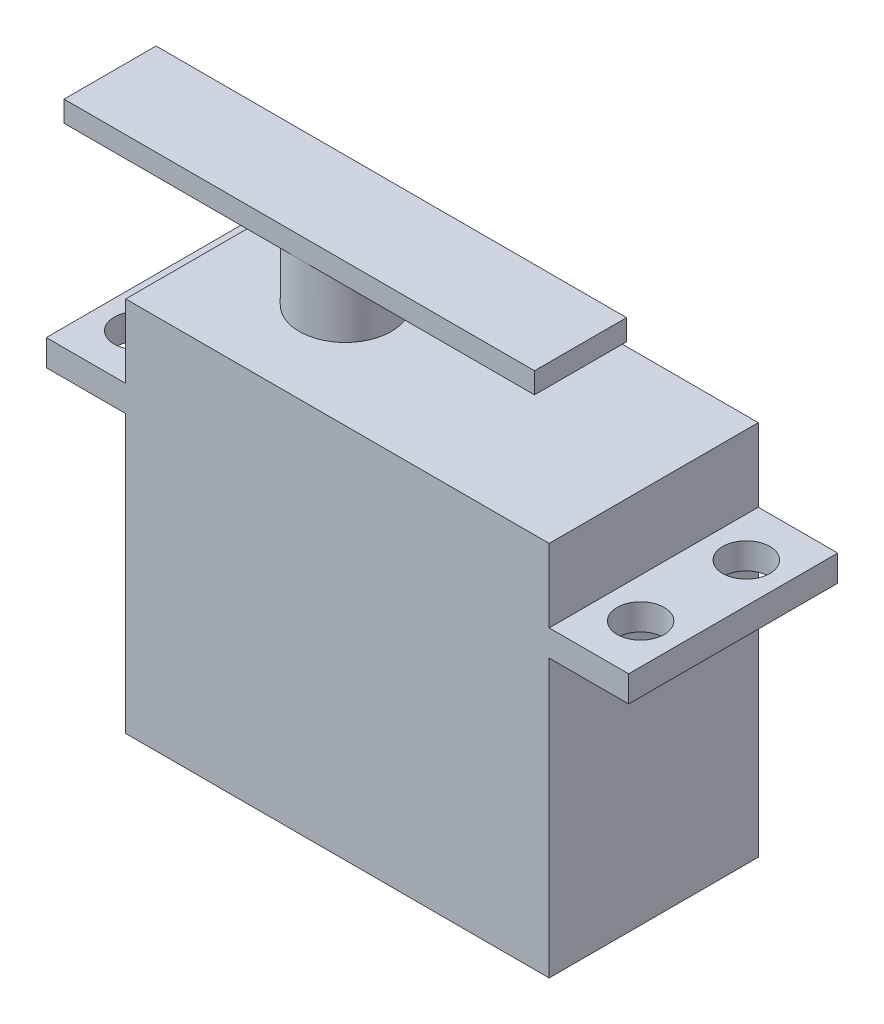
ISO-10303-21;
HEADER;
FILE_DESCRIPTION(('STEP AP214'),'2;1');
FILE_NAME('part.step','',(''),(''),'','','');
FILE_SCHEMA(('AUTOMOTIVE_DESIGN { 1 0 10303 214 1 1 1 1 }'));
ENDSEC;
DATA;
#1=APPLICATION_CONTEXT('core data for automotive mechanical design processes');
#2=APPLICATION_PROTOCOL_DEFINITION('international standard','automotive_design',2000,#1);
#3=PRODUCT_CONTEXT('',#1,'mechanical');
#4=PRODUCT('Part','Part','',(#3));
#5=PRODUCT_RELATED_PRODUCT_CATEGORY('part','',(#4));
#6=PRODUCT_DEFINITION_FORMATION('','',#4);
#7=PRODUCT_DEFINITION_CONTEXT('part definition',#1,'design');
#8=PRODUCT_DEFINITION('design','',#6,#7);
#9=PRODUCT_DEFINITION_SHAPE('','',#8);
#10=(LENGTH_UNIT() NAMED_UNIT(*) SI_UNIT(.MILLI.,.METRE.));
#11=(NAMED_UNIT(*) PLANE_ANGLE_UNIT() SI_UNIT($,.RADIAN.));
#12=(NAMED_UNIT(*) SI_UNIT($,.STERADIAN.) SOLID_ANGLE_UNIT());
#13=UNCERTAINTY_MEASURE_WITH_UNIT(LENGTH_MEASURE(1.E-05),#10,'distance_accuracy_value','');
#14=(GEOMETRIC_REPRESENTATION_CONTEXT(3) GLOBAL_UNCERTAINTY_ASSIGNED_CONTEXT((#13)) GLOBAL_UNIT_ASSIGNED_CONTEXT((#10,
#11,#12)) REPRESENTATION_CONTEXT('',''));
#15=CARTESIAN_POINT('',(0.,0.,0.));
#16=DIRECTION('',(0.,0.,1.));
#17=DIRECTION('',(1.,0.,0.));
#18=AXIS2_PLACEMENT_3D('',#15,#16,#17);
#19=CARTESIAN_POINT('',(-20.25,18.,10.));
#20=DIRECTION('',(0.,-1.,0.));
#21=DIRECTION('',(0.,0.,-1.));
#22=AXIS2_PLACEMENT_3D('',#19,#20,#21);
#23=PLANE('',#22);
#24=DIRECTION('',(-1.,0.,0.));
#25=VECTOR('',#24,1.);
#26=CARTESIAN_POINT('',(-20.25,18.,-10.));
#27=LINE('',#26,#25);
#28=CARTESIAN_POINT('',(20.25,18.,-10.));
#29=VERTEX_POINT('',#28);
#30=CARTESIAN_POINT('',(-20.25,18.,-10.));
#31=VERTEX_POINT('',#30);
#32=EDGE_CURVE('E261',#29,#31,#27,.T.);
#33=ORIENTED_EDGE('',*,*,#32,.T.);
#34=DIRECTION('',(0.,0.,-1.));
#35=VECTOR('',#34,1.);
#36=CARTESIAN_POINT('',(-20.25,18.,10.));
#37=LINE('',#36,#35);
#38=CARTESIAN_POINT('',(-20.25,18.,10.));
#39=VERTEX_POINT('',#38);
#40=EDGE_CURVE('E273',#39,#31,#37,.T.);
#41=ORIENTED_EDGE('',*,*,#40,.F.);
#42=DIRECTION('',(-1.,0.,0.));
#43=VECTOR('',#42,1.);
#44=CARTESIAN_POINT('',(-20.25,18.,10.));
#45=LINE('',#44,#43);
#46=CARTESIAN_POINT('',(20.25,18.,10.));
#47=VERTEX_POINT('',#46);
#48=EDGE_CURVE('E250',#47,#39,#45,.T.);
#49=ORIENTED_EDGE('',*,*,#48,.F.);
#50=DIRECTION('',(0.,0.,-1.));
#51=VECTOR('',#50,1.);
#52=CARTESIAN_POINT('',(20.25,18.,10.));
#53=LINE('',#52,#51);
#54=EDGE_CURVE('E276',#47,#29,#53,.T.);
#55=ORIENTED_EDGE('',*,*,#54,.T.);
#56=EDGE_LOOP('',(#33,#41,#49,#55));
#57=FACE_BOUND('',#56,.T.);
#58=CARTESIAN_POINT('',(-9.25000000000001,18.,0.));
#59=DIRECTION('',(0.,-1.,0.));
#60=DIRECTION('',(0.,0.,-1.));
#61=AXIS2_PLACEMENT_3D('',#58,#59,#60);
#62=CIRCLE('',#61,4.4);
#63=CARTESIAN_POINT('',(-9.25000000000001,18.,-4.4));
#64=VERTEX_POINT('',#63);
#65=EDGE_CURVE('E278',#64,#64,#62,.F.);
#66=ORIENTED_EDGE('',*,*,#65,.F.);
#67=EDGE_LOOP('',(#66));
#68=FACE_BOUND('',#67,.T.);
#69=ADVANCED_FACE('F35',(#57,#68),#23,.F.);
#70=CARTESIAN_POINT('',(20.25,18.,10.));
#71=DIRECTION('',(-1.,0.,0.));
#72=DIRECTION('',(0.,0.,1.));
#73=AXIS2_PLACEMENT_3D('',#70,#71,#72);
#74=PLANE('',#73);
#75=DIRECTION('',(0.,1.,0.));
#76=VECTOR('',#75,1.);
#77=CARTESIAN_POINT('',(20.25,18.,-10.));
#78=LINE('',#77,#76);
#79=CARTESIAN_POINT('',(20.25,-18.,-10.));
#80=VERTEX_POINT('',#79);
#81=CARTESIAN_POINT('',(20.25,8.5,-10.));
#82=VERTEX_POINT('',#81);
#83=EDGE_CURVE('E259',#80,#82,#78,.T.);
#84=ORIENTED_EDGE('',*,*,#83,.T.);
#85=DIRECTION('',(0.,0.,1.));
#86=VECTOR('',#85,1.);
#87=CARTESIAN_POINT('',(20.25,8.5,10.));
#88=LINE('',#87,#86);
#89=CARTESIAN_POINT('',(20.25,8.5,10.));
#90=VERTEX_POINT('',#89);
#91=EDGE_CURVE('E244',#82,#90,#88,.T.);
#92=ORIENTED_EDGE('',*,*,#91,.T.);
#93=DIRECTION('',(0.,1.,0.));
#94=VECTOR('',#93,1.);
#95=CARTESIAN_POINT('',(20.25,18.,10.));
#96=LINE('',#95,#94);
#97=CARTESIAN_POINT('',(20.25,-18.,10.));
#98=VERTEX_POINT('',#97);
#99=EDGE_CURVE('E247',#98,#90,#96,.T.);
#100=ORIENTED_EDGE('',*,*,#99,.F.);
#101=DIRECTION('',(0.,0.,-1.));
#102=VECTOR('',#101,1.);
#103=CARTESIAN_POINT('',(20.25,-18.,10.));
#104=LINE('',#103,#102);
#105=EDGE_CURVE('E258',#98,#80,#104,.T.);
#106=ORIENTED_EDGE('',*,*,#105,.T.);
#107=EDGE_LOOP('',(#84,#92,#100,#106));
#108=FACE_BOUND('',#107,.T.);
#109=ADVANCED_FACE('F310',(#108),#74,.F.);
#110=CARTESIAN_POINT('',(-20.25,18.,10.));
#111=DIRECTION('',(1.,0.,0.));
#112=DIRECTION('',(0.,1.,0.));
#113=AXIS2_PLACEMENT_3D('',#110,#111,#112);
#114=PLANE('',#113);
#115=DIRECTION('',(0.,-1.,0.));
#116=VECTOR('',#115,1.);
#117=CARTESIAN_POINT('',(-20.25,18.,10.));
#118=LINE('',#117,#116);
#119=CARTESIAN_POINT('',(-20.25,8.5,10.));
#120=VERTEX_POINT('',#119);
#121=CARTESIAN_POINT('',(-20.25,-18.,10.));
#122=VERTEX_POINT('',#121);
#123=EDGE_CURVE('E58',#120,#122,#118,.T.);
#124=ORIENTED_EDGE('',*,*,#123,.F.);
#125=DIRECTION('',(0.,0.,-1.));
#126=VECTOR('',#125,1.);
#127=CARTESIAN_POINT('',(-20.25,8.5,10.));
#128=LINE('',#127,#126);
#129=CARTESIAN_POINT('',(-20.25,8.5,-10.));
#130=VERTEX_POINT('',#129);
#131=EDGE_CURVE('E242',#120,#130,#128,.T.);
#132=ORIENTED_EDGE('',*,*,#131,.T.);
#133=DIRECTION('',(0.,-1.,0.));
#134=VECTOR('',#133,1.);
#135=CARTESIAN_POINT('',(-20.25,18.,-10.));
#136=LINE('',#135,#134);
#137=CARTESIAN_POINT('',(-20.25,-18.,-10.));
#138=VERTEX_POINT('',#137);
#139=EDGE_CURVE('E263',#130,#138,#136,.T.);
#140=ORIENTED_EDGE('',*,*,#139,.T.);
#141=DIRECTION('',(0.,0.,-1.));
#142=VECTOR('',#141,1.);
#143=CARTESIAN_POINT('',(-20.25,-18.,10.));
#144=LINE('',#143,#142);
#145=EDGE_CURVE('E270',#122,#138,#144,.T.);
#146=ORIENTED_EDGE('',*,*,#145,.F.);
#147=EDGE_LOOP('',(#124,#132,#140,#146));
#148=FACE_BOUND('',#147,.T.);
#149=ADVANCED_FACE('F315',(#148),#114,.F.);
#150=CARTESIAN_POINT('',(20.25,11.,10.));
#151=VERTEX_POINT('',#150);
#152=EDGE_CURVE('E251',#151,#47,#96,.T.);
#153=ORIENTED_EDGE('',*,*,#152,.F.);
#154=DIRECTION('',(0.,0.,-1.));
#155=VECTOR('',#154,1.);
#156=CARTESIAN_POINT('',(20.25,11.,10.));
#157=LINE('',#156,#155);
#158=CARTESIAN_POINT('',(20.25,11.,-10.));
#159=VERTEX_POINT('',#158);
#160=EDGE_CURVE('E239',#151,#159,#157,.T.);
#161=ORIENTED_EDGE('',*,*,#160,.T.);
#162=EDGE_CURVE('E246',#159,#29,#78,.T.);
#163=ORIENTED_EDGE('',*,*,#162,.T.);
#164=ORIENTED_EDGE('',*,*,#54,.F.);
#165=EDGE_LOOP('',(#153,#161,#163,#164));
#166=FACE_BOUND('',#165,.T.);
#167=ADVANCED_FACE('F37',(#166),#74,.F.);
#168=CARTESIAN_POINT('',(-20.25,11.,-10.));
#169=VERTEX_POINT('',#168);
#170=EDGE_CURVE('E264',#31,#169,#136,.T.);
#171=ORIENTED_EDGE('',*,*,#170,.T.);
#172=DIRECTION('',(0.,0.,1.));
#173=VECTOR('',#172,1.);
#174=CARTESIAN_POINT('',(-20.25,11.,10.));
#175=LINE('',#174,#173);
#176=CARTESIAN_POINT('',(-20.25,11.,10.));
#177=VERTEX_POINT('',#176);
#178=EDGE_CURVE('E237',#169,#177,#175,.T.);
#179=ORIENTED_EDGE('',*,*,#178,.T.);
#180=EDGE_CURVE('E253',#39,#177,#118,.T.);
#181=ORIENTED_EDGE('',*,*,#180,.F.);
#182=ORIENTED_EDGE('',*,*,#40,.T.);
#183=EDGE_LOOP('',(#171,#179,#181,#182));
#184=FACE_BOUND('',#183,.T.);
#185=ADVANCED_FACE('F319',(#184),#114,.F.);
#186=CARTESIAN_POINT('',(-20.25,-18.,10.));
#187=DIRECTION('',(0.,1.,0.));
#188=DIRECTION('',(0.,0.,1.));
#189=AXIS2_PLACEMENT_3D('',#186,#187,#188);
#190=PLANE('',#189);
#191=DIRECTION('',(1.,0.,0.));
#192=VECTOR('',#191,1.);
#193=CARTESIAN_POINT('',(-20.25,-18.,-10.));
#194=LINE('',#193,#192);
#195=EDGE_CURVE('E266',#138,#80,#194,.T.);
#196=ORIENTED_EDGE('',*,*,#195,.T.);
#197=ORIENTED_EDGE('',*,*,#105,.F.);
#198=DIRECTION('',(1.,0.,0.));
#199=VECTOR('',#198,1.);
#200=CARTESIAN_POINT('',(-20.25,-18.,10.));
#201=LINE('',#200,#199);
#202=EDGE_CURVE('E256',#122,#98,#201,.T.);
#203=ORIENTED_EDGE('',*,*,#202,.F.);
#204=ORIENTED_EDGE('',*,*,#145,.T.);
#205=EDGE_LOOP('',(#196,#197,#203,#204));
#206=FACE_BOUND('',#205,.T.);
#207=ADVANCED_FACE('F322',(#206),#190,.F.);
#208=CARTESIAN_POINT('',(0.,0.,10.));
#209=DIRECTION('',(0.,0.,1.));
#210=DIRECTION('',(1.,0.,0.));
#211=AXIS2_PLACEMENT_3D('',#208,#209,#210);
#212=PLANE('',#211);
#213=ORIENTED_EDGE('',*,*,#180,.T.);
#214=DIRECTION('',(-1.,0.,0.));
#215=VECTOR('',#214,1.);
#216=CARTESIAN_POINT('',(-27.85,11.,10.));
#217=LINE('',#216,#215);
#218=CARTESIAN_POINT('',(-27.85,11.,10.));
#219=VERTEX_POINT('',#218);
#220=EDGE_CURVE('E214',#177,#219,#217,.T.);
#221=ORIENTED_EDGE('',*,*,#220,.T.);
#222=DIRECTION('',(0.,-1.,0.));
#223=VECTOR('',#222,1.);
#224=CARTESIAN_POINT('',(-27.85,11.,10.));
#225=LINE('',#224,#223);
#226=CARTESIAN_POINT('',(-27.85,8.5,10.));
#227=VERTEX_POINT('',#226);
#228=EDGE_CURVE('E218',#219,#227,#225,.T.);
#229=ORIENTED_EDGE('',*,*,#228,.T.);
#230=DIRECTION('',(1.,0.,0.));
#231=VECTOR('',#230,1.);
#232=CARTESIAN_POINT('',(-27.85,8.5,10.));
#233=LINE('',#232,#231);
#234=EDGE_CURVE('E222',#227,#120,#233,.T.);
#235=ORIENTED_EDGE('',*,*,#234,.T.);
#236=ORIENTED_EDGE('',*,*,#123,.T.);
#237=ORIENTED_EDGE('',*,*,#202,.T.);
#238=ORIENTED_EDGE('',*,*,#99,.T.);
#239=CARTESIAN_POINT('',(27.85,8.5,10.));
#240=VERTEX_POINT('',#239);
#241=EDGE_CURVE('E221',#90,#240,#233,.T.);
#242=ORIENTED_EDGE('',*,*,#241,.T.);
#243=DIRECTION('',(0.,1.,0.));
#244=VECTOR('',#243,1.);
#245=CARTESIAN_POINT('',(27.85,11.,10.));
#246=LINE('',#245,#244);
#247=CARTESIAN_POINT('',(27.85,11.,10.));
#248=VERTEX_POINT('',#247);
#249=EDGE_CURVE('E197',#240,#248,#246,.T.);
#250=ORIENTED_EDGE('',*,*,#249,.T.);
#251=EDGE_CURVE('E215',#248,#151,#217,.T.);
#252=ORIENTED_EDGE('',*,*,#251,.T.);
#253=ORIENTED_EDGE('',*,*,#152,.T.);
#254=ORIENTED_EDGE('',*,*,#48,.T.);
#255=EDGE_LOOP('',(#213,#221,#229,#235,#236,#237,#238,#242,#250,#252,#253,#254));
#256=FACE_BOUND('',#255,.T.);
#257=ADVANCED_FACE('F326',(#256),#212,.T.);
#258=CARTESIAN_POINT('',(0.,0.,-10.));
#259=DIRECTION('',(0.,0.,1.));
#260=DIRECTION('',(1.,0.,0.));
#261=AXIS2_PLACEMENT_3D('',#258,#259,#260);
#262=PLANE('',#261);
#263=ORIENTED_EDGE('',*,*,#162,.F.);
#264=DIRECTION('',(1.,0.,0.));
#265=VECTOR('',#264,1.);
#266=CARTESIAN_POINT('',(-27.85,11.,-10.));
#267=LINE('',#266,#265);
#268=CARTESIAN_POINT('',(27.85,11.,-10.));
#269=VERTEX_POINT('',#268);
#270=EDGE_CURVE('E211',#159,#269,#267,.T.);
#271=ORIENTED_EDGE('',*,*,#270,.T.);
#272=DIRECTION('',(0.,-1.,0.));
#273=VECTOR('',#272,1.);
#274=CARTESIAN_POINT('',(27.85,11.,-10.));
#275=LINE('',#274,#273);
#276=CARTESIAN_POINT('',(27.85,8.5,-10.));
#277=VERTEX_POINT('',#276);
#278=EDGE_CURVE('E209',#269,#277,#275,.T.);
#279=ORIENTED_EDGE('',*,*,#278,.T.);
#280=DIRECTION('',(-1.,0.,0.));
#281=VECTOR('',#280,1.);
#282=CARTESIAN_POINT('',(-27.85,8.5,-10.));
#283=LINE('',#282,#281);
#284=EDGE_CURVE('E206',#277,#82,#283,.T.);
#285=ORIENTED_EDGE('',*,*,#284,.T.);
#286=ORIENTED_EDGE('',*,*,#83,.F.);
#287=ORIENTED_EDGE('',*,*,#195,.F.);
#288=ORIENTED_EDGE('',*,*,#139,.F.);
#289=CARTESIAN_POINT('',(-27.85,8.5,-10.));
#290=VERTEX_POINT('',#289);
#291=EDGE_CURVE('E204',#130,#290,#283,.T.);
#292=ORIENTED_EDGE('',*,*,#291,.T.);
#293=DIRECTION('',(0.,1.,0.));
#294=VECTOR('',#293,1.);
#295=CARTESIAN_POINT('',(-27.85,11.,-10.));
#296=LINE('',#295,#294);
#297=CARTESIAN_POINT('',(-27.85,11.,-10.));
#298=VERTEX_POINT('',#297);
#299=EDGE_CURVE('E202',#290,#298,#296,.T.);
#300=ORIENTED_EDGE('',*,*,#299,.T.);
#301=EDGE_CURVE('E234',#298,#169,#267,.T.);
#302=ORIENTED_EDGE('',*,*,#301,.T.);
#303=ORIENTED_EDGE('',*,*,#170,.F.);
#304=ORIENTED_EDGE('',*,*,#32,.F.);
#305=EDGE_LOOP('',(#263,#271,#279,#285,#286,#287,#288,#292,#300,#302,#303,#304));
#306=FACE_BOUND('',#305,.T.);
#307=ADVANCED_FACE('F328',(#306),#262,.F.);
#308=CARTESIAN_POINT('',(-27.85,11.,-65.7560759020934));
#309=DIRECTION('',(-1.,0.,0.));
#310=DIRECTION('',(0.,0.,1.));
#311=AXIS2_PLACEMENT_3D('',#308,#309,#310);
#312=PLANE('',#311);
#313=ORIENTED_EDGE('',*,*,#299,.F.);
#314=DIRECTION('',(0.,0.,1.));
#315=VECTOR('',#314,1.);
#316=CARTESIAN_POINT('',(-27.85,8.5,-65.7560759020934));
#317=LINE('',#316,#315);
#318=EDGE_CURVE('E228',#290,#227,#317,.T.);
#319=ORIENTED_EDGE('',*,*,#318,.T.);
#320=ORIENTED_EDGE('',*,*,#228,.F.);
#321=DIRECTION('',(0.,0.,1.));
#322=VECTOR('',#321,1.);
#323=CARTESIAN_POINT('',(-27.85,11.,-65.7560759020934));
#324=LINE('',#323,#322);
#325=EDGE_CURVE('E230',#298,#219,#324,.T.);
#326=ORIENTED_EDGE('',*,*,#325,.F.);
#327=EDGE_LOOP('',(#313,#319,#320,#326));
#328=FACE_BOUND('',#327,.T.);
#329=ADVANCED_FACE('F331',(#328),#312,.T.);
#330=CARTESIAN_POINT('',(-27.85,11.,-65.7560759020934));
#331=DIRECTION('',(0.,1.,0.));
#332=DIRECTION('',(0.,0.,1.));
#333=AXIS2_PLACEMENT_3D('',#330,#331,#332);
#334=PLANE('',#333);
#335=CARTESIAN_POINT('',(-24.05,11.,5.05));
#336=DIRECTION('',(0.,1.,0.));
#337=DIRECTION('',(0.,0.,1.));
#338=AXIS2_PLACEMENT_3D('',#335,#336,#337);
#339=CIRCLE('',#338,2.25);
#340=CARTESIAN_POINT('',(-24.05,11.,7.3));
#341=VERTEX_POINT('',#340);
#342=EDGE_CURVE('E466',#341,#341,#339,.F.);
#343=ORIENTED_EDGE('',*,*,#342,.T.);
#344=EDGE_LOOP('',(#343));
#345=FACE_BOUND('',#344,.T.);
#346=CARTESIAN_POINT('',(-24.05,11.,-5.05));
#347=DIRECTION('',(0.,1.,0.));
#348=DIRECTION('',(0.,0.,1.));
#349=AXIS2_PLACEMENT_3D('',#346,#347,#348);
#350=CIRCLE('',#349,2.25);
#351=CARTESIAN_POINT('',(-24.05,11.,-2.8));
#352=VERTEX_POINT('',#351);
#353=EDGE_CURVE('E183',#352,#352,#350,.F.);
#354=ORIENTED_EDGE('',*,*,#353,.T.);
#355=EDGE_LOOP('',(#354));
#356=FACE_BOUND('',#355,.T.);
#357=ORIENTED_EDGE('',*,*,#178,.F.);
#358=ORIENTED_EDGE('',*,*,#301,.F.);
#359=ORIENTED_EDGE('',*,*,#325,.T.);
#360=ORIENTED_EDGE('',*,*,#220,.F.);
#361=EDGE_LOOP('',(#357,#358,#359,#360));
#362=FACE_BOUND('',#361,.T.);
#363=ADVANCED_FACE('F345',(#345,#356,#362),#334,.T.);
#364=CARTESIAN_POINT('',(-27.85,8.5,-65.7560759020934));
#365=DIRECTION('',(0.,-1.,0.));
#366=DIRECTION('',(0.,0.,-1.));
#367=AXIS2_PLACEMENT_3D('',#364,#365,#366);
#368=PLANE('',#367);
#369=CARTESIAN_POINT('',(-24.05,8.5,5.05));
#370=DIRECTION('',(0.,-1.,0.));
#371=DIRECTION('',(0.,0.,-1.));
#372=AXIS2_PLACEMENT_3D('',#369,#370,#371);
#373=CIRCLE('',#372,2.25);
#374=CARTESIAN_POINT('',(-24.05,8.5,2.8));
#375=VERTEX_POINT('',#374);
#376=EDGE_CURVE('E463',#375,#375,#373,.T.);
#377=ORIENTED_EDGE('',*,*,#376,.F.);
#378=EDGE_LOOP('',(#377));
#379=FACE_BOUND('',#378,.T.);
#380=CARTESIAN_POINT('',(-24.05,8.5,-5.05));
#381=DIRECTION('',(0.,-1.,0.));
#382=DIRECTION('',(0.,0.,-1.));
#383=AXIS2_PLACEMENT_3D('',#380,#381,#382);
#384=CIRCLE('',#383,2.25);
#385=CARTESIAN_POINT('',(-24.05,8.5,-7.3));
#386=VERTEX_POINT('',#385);
#387=EDGE_CURVE('E468',#386,#386,#384,.T.);
#388=ORIENTED_EDGE('',*,*,#387,.F.);
#389=EDGE_LOOP('',(#388));
#390=FACE_BOUND('',#389,.T.);
#391=ORIENTED_EDGE('',*,*,#131,.F.);
#392=ORIENTED_EDGE('',*,*,#234,.F.);
#393=ORIENTED_EDGE('',*,*,#318,.F.);
#394=ORIENTED_EDGE('',*,*,#291,.F.);
#395=EDGE_LOOP('',(#391,#392,#393,#394));
#396=FACE_BOUND('',#395,.T.);
#397=ADVANCED_FACE('F350',(#379,#390,#396),#368,.T.);
#398=CARTESIAN_POINT('',(24.05,8.5,5.05));
#399=DIRECTION('',(0.,-1.,0.));
#400=DIRECTION('',(0.,0.,-1.));
#401=AXIS2_PLACEMENT_3D('',#398,#399,#400);
#402=CIRCLE('',#401,2.25);
#403=CARTESIAN_POINT('',(24.05,8.5,2.8));
#404=VERTEX_POINT('',#403);
#405=EDGE_CURVE('E450',#404,#404,#402,.T.);
#406=ORIENTED_EDGE('',*,*,#405,.F.);
#407=EDGE_LOOP('',(#406));
#408=FACE_BOUND('',#407,.T.);
#409=CARTESIAN_POINT('',(24.05,8.5,-5.05));
#410=DIRECTION('',(0.,-1.,0.));
#411=DIRECTION('',(0.,0.,-1.));
#412=AXIS2_PLACEMENT_3D('',#409,#410,#411);
#413=CIRCLE('',#412,2.25);
#414=CARTESIAN_POINT('',(24.05,8.5,-7.3));
#415=VERTEX_POINT('',#414);
#416=EDGE_CURVE('E454',#415,#415,#413,.T.);
#417=ORIENTED_EDGE('',*,*,#416,.F.);
#418=EDGE_LOOP('',(#417));
#419=FACE_BOUND('',#418,.T.);
#420=ORIENTED_EDGE('',*,*,#91,.F.);
#421=ORIENTED_EDGE('',*,*,#284,.F.);
#422=DIRECTION('',(0.,0.,1.));
#423=VECTOR('',#422,1.);
#424=CARTESIAN_POINT('',(27.85,8.5,-65.7560759020934));
#425=LINE('',#424,#423);
#426=EDGE_CURVE('E205',#277,#240,#425,.T.);
#427=ORIENTED_EDGE('',*,*,#426,.T.);
#428=ORIENTED_EDGE('',*,*,#241,.F.);
#429=EDGE_LOOP('',(#420,#421,#427,#428));
#430=FACE_BOUND('',#429,.T.);
#431=ADVANCED_FACE('F343',(#408,#419,#430),#368,.T.);
#432=CARTESIAN_POINT('',(24.05,11.,5.05));
#433=DIRECTION('',(0.,1.,0.));
#434=DIRECTION('',(0.,0.,1.));
#435=AXIS2_PLACEMENT_3D('',#432,#433,#434);
#436=CIRCLE('',#435,2.25);
#437=CARTESIAN_POINT('',(24.05,11.,7.3));
#438=VERTEX_POINT('',#437);
#439=EDGE_CURVE('E453',#438,#438,#436,.F.);
#440=ORIENTED_EDGE('',*,*,#439,.T.);
#441=EDGE_LOOP('',(#440));
#442=FACE_BOUND('',#441,.T.);
#443=CARTESIAN_POINT('',(24.05,11.,-5.05));
#444=DIRECTION('',(0.,1.,0.));
#445=DIRECTION('',(0.,0.,1.));
#446=AXIS2_PLACEMENT_3D('',#443,#444,#445);
#447=CIRCLE('',#446,2.25);
#448=CARTESIAN_POINT('',(24.05,11.,-2.8));
#449=VERTEX_POINT('',#448);
#450=EDGE_CURVE('E457',#449,#449,#447,.F.);
#451=ORIENTED_EDGE('',*,*,#450,.T.);
#452=EDGE_LOOP('',(#451));
#453=FACE_BOUND('',#452,.T.);
#454=ORIENTED_EDGE('',*,*,#160,.F.);
#455=ORIENTED_EDGE('',*,*,#251,.F.);
#456=DIRECTION('',(0.,0.,1.));
#457=VECTOR('',#456,1.);
#458=CARTESIAN_POINT('',(27.85,11.,-65.7560759020934));
#459=LINE('',#458,#457);
#460=EDGE_CURVE('E225',#269,#248,#459,.T.);
#461=ORIENTED_EDGE('',*,*,#460,.F.);
#462=ORIENTED_EDGE('',*,*,#270,.F.);
#463=EDGE_LOOP('',(#454,#455,#461,#462));
#464=FACE_BOUND('',#463,.T.);
#465=ADVANCED_FACE('F339',(#442,#453,#464),#334,.T.);
#466=CARTESIAN_POINT('',(27.85,11.,-65.7560759020934));
#467=DIRECTION('',(1.,0.,0.));
#468=DIRECTION('',(0.,1.,0.));
#469=AXIS2_PLACEMENT_3D('',#466,#467,#468);
#470=PLANE('',#469);
#471=ORIENTED_EDGE('',*,*,#278,.F.);
#472=ORIENTED_EDGE('',*,*,#460,.T.);
#473=ORIENTED_EDGE('',*,*,#249,.F.);
#474=ORIENTED_EDGE('',*,*,#426,.F.);
#475=EDGE_LOOP('',(#471,#472,#473,#474));
#476=FACE_BOUND('',#475,.T.);
#477=ADVANCED_FACE('F336',(#476),#470,.T.);
#478=CARTESIAN_POINT('',(-9.25000000000001,26.,0.));
#479=DIRECTION('',(0.,-1.,0.));
#480=DIRECTION('',(0.,0.,-1.));
#481=AXIS2_PLACEMENT_3D('',#478,#479,#480);
#482=CYLINDRICAL_SURFACE('',#481,4.4);
#483=CARTESIAN_POINT('',(-9.25000000000001,24.,0.));
#484=DIRECTION('',(0.,-1.,0.));
#485=DIRECTION('',(0.,0.,-1.));
#486=AXIS2_PLACEMENT_3D('',#483,#484,#485);
#487=CIRCLE('',#486,4.4);
#488=CARTESIAN_POINT('',(-9.25000000000001,24.,4.4));
#489=VERTEX_POINT('',#488);
#490=CARTESIAN_POINT('',(-9.25000000000001,24.,-4.4));
#491=VERTEX_POINT('',#490);
#492=EDGE_CURVE('E39',#489,#491,#487,.T.);
#493=ORIENTED_EDGE('',*,*,#492,.T.);
#494=EDGE_CURVE('E11',#491,#489,#487,.T.);
#495=ORIENTED_EDGE('',*,*,#494,.T.);
#496=EDGE_LOOP('',(#493,#495));
#497=FACE_BOUND('',#496,.T.);
#498=ORIENTED_EDGE('',*,*,#65,.T.);
#499=EDGE_LOOP('',(#498));
#500=FACE_BOUND('',#499,.T.);
#501=ADVANCED_FACE('F283',(#497,#500),#482,.T.);
#502=CARTESIAN_POINT('',(0.,24.,0.));
#503=DIRECTION('',(0.,-1.,0.));
#504=DIRECTION('',(0.,0.,-1.));
#505=AXIS2_PLACEMENT_3D('',#502,#503,#504);
#506=PLANE('',#505);
#507=ORIENTED_EDGE('',*,*,#494,.F.);
#508=DIRECTION('',(-1.,0.,0.));
#509=VECTOR('',#508,1.);
#510=CARTESIAN_POINT('',(-31.75,24.,-4.4));
#511=LINE('',#510,#509);
#512=CARTESIAN_POINT('',(13.25,24.,-4.4));
#513=VERTEX_POINT('',#512);
#514=EDGE_CURVE('E50',#513,#491,#511,.T.);
#515=ORIENTED_EDGE('',*,*,#514,.F.);
#516=DIRECTION('',(0.,0.,-1.));
#517=VECTOR('',#516,1.);
#518=CARTESIAN_POINT('',(13.25,24.,4.4));
#519=LINE('',#518,#517);
#520=CARTESIAN_POINT('',(13.25,24.,4.4));
#521=VERTEX_POINT('',#520);
#522=EDGE_CURVE('E169',#521,#513,#519,.T.);
#523=ORIENTED_EDGE('',*,*,#522,.F.);
#524=DIRECTION('',(1.,0.,0.));
#525=VECTOR('',#524,1.);
#526=CARTESIAN_POINT('',(-31.75,24.,4.4));
#527=LINE('',#526,#525);
#528=EDGE_CURVE('E188',#489,#521,#527,.T.);
#529=ORIENTED_EDGE('',*,*,#528,.F.);
#530=EDGE_LOOP('',(#507,#515,#523,#529));
#531=FACE_BOUND('',#530,.T.);
#532=ADVANCED_FACE('F167',(#531),#506,.T.);
#533=ORIENTED_EDGE('',*,*,#492,.F.);
#534=CARTESIAN_POINT('',(-31.75,24.,4.4));
#535=VERTEX_POINT('',#534);
#536=EDGE_CURVE('E162',#535,#489,#527,.T.);
#537=ORIENTED_EDGE('',*,*,#536,.F.);
#538=DIRECTION('',(0.,0.,1.));
#539=VECTOR('',#538,1.);
#540=CARTESIAN_POINT('',(-31.75,24.,4.4));
#541=LINE('',#540,#539);
#542=CARTESIAN_POINT('',(-31.75,24.,-4.4));
#543=VERTEX_POINT('',#542);
#544=EDGE_CURVE('E171',#543,#535,#541,.T.);
#545=ORIENTED_EDGE('',*,*,#544,.F.);
#546=EDGE_CURVE('E172',#491,#543,#511,.T.);
#547=ORIENTED_EDGE('',*,*,#546,.F.);
#548=EDGE_LOOP('',(#533,#537,#545,#547));
#549=FACE_BOUND('',#548,.T.);
#550=ADVANCED_FACE('F286',(#549),#506,.T.);
#551=CARTESIAN_POINT('',(-31.75,24.,4.4));
#552=DIRECTION('',(0.,0.,1.));
#553=DIRECTION('',(1.,0.,0.));
#554=AXIS2_PLACEMENT_3D('',#551,#552,#553);
#555=PLANE('',#554);
#556=ORIENTED_EDGE('',*,*,#536,.T.);
#557=ORIENTED_EDGE('',*,*,#528,.T.);
#558=DIRECTION('',(0.,1.,0.));
#559=VECTOR('',#558,1.);
#560=CARTESIAN_POINT('',(13.25,24.,4.4));
#561=LINE('',#560,#559);
#562=CARTESIAN_POINT('',(13.25,26.,4.4));
#563=VERTEX_POINT('',#562);
#564=EDGE_CURVE('E177',#521,#563,#561,.T.);
#565=ORIENTED_EDGE('',*,*,#564,.T.);
#566=DIRECTION('',(1.,0.,0.));
#567=VECTOR('',#566,1.);
#568=CARTESIAN_POINT('',(-31.75,26.,4.4));
#569=LINE('',#568,#567);
#570=CARTESIAN_POINT('',(-31.75,26.,4.4));
#571=VERTEX_POINT('',#570);
#572=EDGE_CURVE('E178',#571,#563,#569,.T.);
#573=ORIENTED_EDGE('',*,*,#572,.F.);
#574=DIRECTION('',(0.,1.,0.));
#575=VECTOR('',#574,1.);
#576=CARTESIAN_POINT('',(-31.75,24.,4.4));
#577=LINE('',#576,#575);
#578=EDGE_CURVE('E198',#535,#571,#577,.T.);
#579=ORIENTED_EDGE('',*,*,#578,.F.);
#580=EDGE_LOOP('',(#556,#557,#565,#573,#579));
#581=FACE_BOUND('',#580,.T.);
#582=ADVANCED_FACE('F289',(#581),#555,.T.);
#583=CARTESIAN_POINT('',(-31.75,24.,-4.4));
#584=DIRECTION('',(0.,0.,-1.));
#585=DIRECTION('',(-1.,0.,0.));
#586=AXIS2_PLACEMENT_3D('',#583,#584,#585);
#587=PLANE('',#586);
#588=ORIENTED_EDGE('',*,*,#514,.T.);
#589=ORIENTED_EDGE('',*,*,#546,.T.);
#590=DIRECTION('',(0.,1.,0.));
#591=VECTOR('',#590,1.);
#592=CARTESIAN_POINT('',(-31.75,24.,-4.4));
#593=LINE('',#592,#591);
#594=CARTESIAN_POINT('',(-31.75,26.,-4.4));
#595=VERTEX_POINT('',#594);
#596=EDGE_CURVE('E161',#543,#595,#593,.T.);
#597=ORIENTED_EDGE('',*,*,#596,.T.);
#598=DIRECTION('',(-1.,0.,0.));
#599=VECTOR('',#598,1.);
#600=CARTESIAN_POINT('',(-31.75,26.,-4.4));
#601=LINE('',#600,#599);
#602=CARTESIAN_POINT('',(13.25,26.,-4.4));
#603=VERTEX_POINT('',#602);
#604=EDGE_CURVE('E156',#603,#595,#601,.T.);
#605=ORIENTED_EDGE('',*,*,#604,.F.);
#606=DIRECTION('',(0.,1.,0.));
#607=VECTOR('',#606,1.);
#608=CARTESIAN_POINT('',(13.25,24.,-4.4));
#609=LINE('',#608,#607);
#610=EDGE_CURVE('E153',#513,#603,#609,.T.);
#611=ORIENTED_EDGE('',*,*,#610,.F.);
#612=EDGE_LOOP('',(#588,#589,#597,#605,#611));
#613=FACE_BOUND('',#612,.T.);
#614=ADVANCED_FACE('F154',(#613),#587,.T.);
#615=CARTESIAN_POINT('',(13.25,24.,4.4));
#616=DIRECTION('',(1.,0.,0.));
#617=DIRECTION('',(0.,0.,-1.));
#618=AXIS2_PLACEMENT_3D('',#615,#616,#617);
#619=PLANE('',#618);
#620=DIRECTION('',(0.,0.,-1.));
#621=VECTOR('',#620,1.);
#622=CARTESIAN_POINT('',(13.25,26.,4.4));
#623=LINE('',#622,#621);
#624=EDGE_CURVE('E191',#563,#603,#623,.T.);
#625=ORIENTED_EDGE('',*,*,#624,.F.);
#626=ORIENTED_EDGE('',*,*,#564,.F.);
#627=ORIENTED_EDGE('',*,*,#522,.T.);
#628=ORIENTED_EDGE('',*,*,#610,.T.);
#629=EDGE_LOOP('',(#625,#626,#627,#628));
#630=FACE_BOUND('',#629,.T.);
#631=ADVANCED_FACE('F175',(#630),#619,.T.);
#632=CARTESIAN_POINT('',(-31.75,24.,4.4));
#633=DIRECTION('',(-1.,0.,0.));
#634=DIRECTION('',(0.,0.,1.));
#635=AXIS2_PLACEMENT_3D('',#632,#633,#634);
#636=PLANE('',#635);
#637=DIRECTION('',(0.,0.,1.));
#638=VECTOR('',#637,1.);
#639=CARTESIAN_POINT('',(-31.75,26.,4.4));
#640=LINE('',#639,#638);
#641=EDGE_CURVE('E180',#595,#571,#640,.T.);
#642=ORIENTED_EDGE('',*,*,#641,.F.);
#643=ORIENTED_EDGE('',*,*,#596,.F.);
#644=ORIENTED_EDGE('',*,*,#544,.T.);
#645=ORIENTED_EDGE('',*,*,#578,.T.);
#646=EDGE_LOOP('',(#642,#643,#644,#645));
#647=FACE_BOUND('',#646,.T.);
#648=ADVANCED_FACE('F293',(#647),#636,.T.);
#649=CARTESIAN_POINT('',(-9.25000000000001,26.,0.));
#650=DIRECTION('',(0.,1.,0.));
#651=DIRECTION('',(0.,0.,1.));
#652=AXIS2_PLACEMENT_3D('',#649,#650,#651);
#653=PLANE('',#652);
#654=ORIENTED_EDGE('',*,*,#641,.T.);
#655=ORIENTED_EDGE('',*,*,#572,.T.);
#656=ORIENTED_EDGE('',*,*,#624,.T.);
#657=ORIENTED_EDGE('',*,*,#604,.T.);
#658=EDGE_LOOP('',(#654,#655,#656,#657));
#659=FACE_BOUND('',#658,.T.);
#660=ADVANCED_FACE('F295',(#659),#653,.T.);
#661=CARTESIAN_POINT('',(-24.05,17.3639610306789,-5.05));
#662=DIRECTION('',(0.,-1.,0.));
#663=DIRECTION('',(0.,0.,-1.));
#664=AXIS2_PLACEMENT_3D('',#661,#662,#663);
#665=CYLINDRICAL_SURFACE('',#664,2.25);
#666=ORIENTED_EDGE('',*,*,#387,.T.);
#667=EDGE_LOOP('',(#666));
#668=FACE_BOUND('',#667,.T.);
#669=ORIENTED_EDGE('',*,*,#353,.F.);
#670=EDGE_LOOP('',(#669));
#671=FACE_BOUND('',#670,.T.);
#672=ADVANCED_FACE('F297',(#668,#671),#665,.F.);
#673=CARTESIAN_POINT('',(-24.05,17.3639610306789,5.05));
#674=DIRECTION('',(0.,-1.,0.));
#675=DIRECTION('',(0.,0.,-1.));
#676=AXIS2_PLACEMENT_3D('',#673,#674,#675);
#677=CYLINDRICAL_SURFACE('',#676,2.25);
#678=ORIENTED_EDGE('',*,*,#376,.T.);
#679=EDGE_LOOP('',(#678));
#680=FACE_BOUND('',#679,.T.);
#681=ORIENTED_EDGE('',*,*,#342,.F.);
#682=EDGE_LOOP('',(#681));
#683=FACE_BOUND('',#682,.T.);
#684=ADVANCED_FACE('F303',(#680,#683),#677,.F.);
#685=CARTESIAN_POINT('',(24.05,17.3639610306789,-5.05));
#686=DIRECTION('',(0.,-1.,0.));
#687=DIRECTION('',(0.,0.,-1.));
#688=AXIS2_PLACEMENT_3D('',#685,#686,#687);
#689=CYLINDRICAL_SURFACE('',#688,2.25);
#690=ORIENTED_EDGE('',*,*,#416,.T.);
#691=EDGE_LOOP('',(#690));
#692=FACE_BOUND('',#691,.T.);
#693=ORIENTED_EDGE('',*,*,#450,.F.);
#694=EDGE_LOOP('',(#693));
#695=FACE_BOUND('',#694,.T.);
#696=ADVANCED_FACE('F424',(#692,#695),#689,.F.);
#697=CARTESIAN_POINT('',(24.05,17.3639610306789,5.05));
#698=DIRECTION('',(0.,-1.,0.));
#699=DIRECTION('',(0.,0.,-1.));
#700=AXIS2_PLACEMENT_3D('',#697,#698,#699);
#701=CYLINDRICAL_SURFACE('',#700,2.25);
#702=ORIENTED_EDGE('',*,*,#405,.T.);
#703=EDGE_LOOP('',(#702));
#704=FACE_BOUND('',#703,.T.);
#705=ORIENTED_EDGE('',*,*,#439,.F.);
#706=EDGE_LOOP('',(#705));
#707=FACE_BOUND('',#706,.T.);
#708=ADVANCED_FACE('F433',(#704,#707),#701,.F.);
#709=CLOSED_SHELL('',(#69,#109,#149,#167,#185,#207,#257,#307,#329,#363,#397,#431,#465,#477,#501,
#532,#550,#582,#614,#631,#648,#660,#672,#684,#696,#708));
#710=MANIFOLD_SOLID_BREP('B2',#709);
#711=ADVANCED_BREP_SHAPE_REPRESENTATION('',(#18,#710),#14);
#712=SHAPE_DEFINITION_REPRESENTATION(#9,#711);
ENDSEC;
END-ISO-10303-21;
